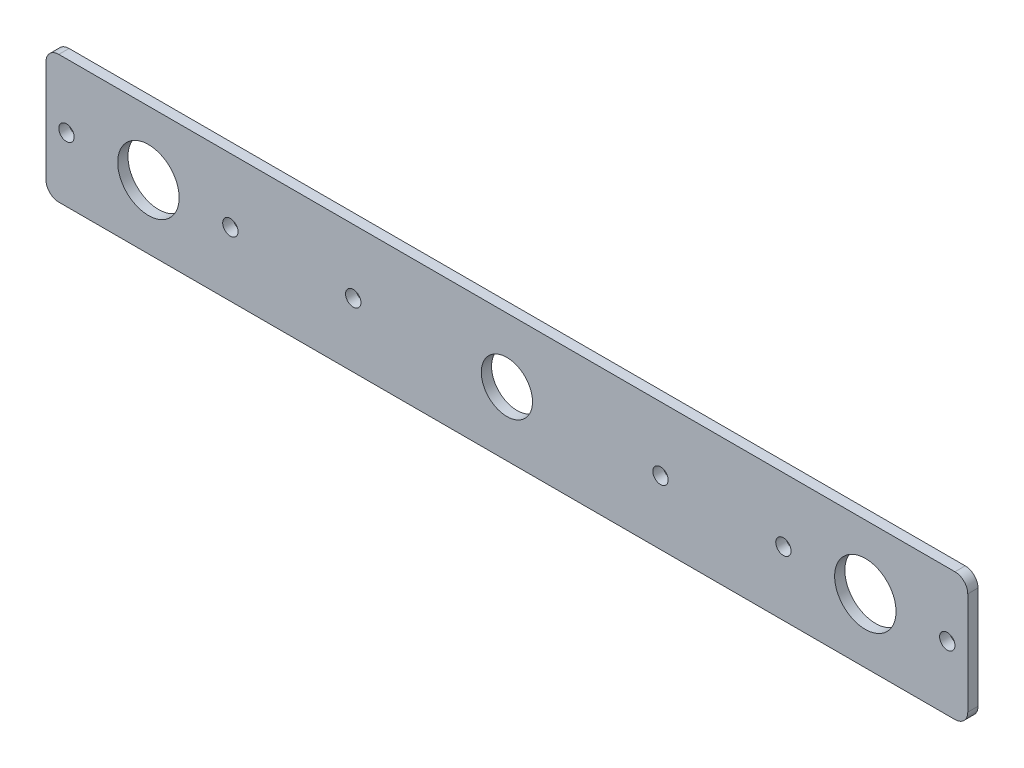
ISO-10303-21;
HEADER;
FILE_DESCRIPTION(('STEP AP214'),'2;1');
FILE_NAME('part.step','',(''),(''),'','','');
FILE_SCHEMA(('AUTOMOTIVE_DESIGN { 1 0 10303 214 1 1 1 1 }'));
ENDSEC;
DATA;
#1=APPLICATION_CONTEXT('core data for automotive mechanical design processes');
#2=APPLICATION_PROTOCOL_DEFINITION('international standard','automotive_design',2000,#1);
#3=PRODUCT_CONTEXT('',#1,'mechanical');
#4=PRODUCT('Part','Part','',(#3));
#5=PRODUCT_RELATED_PRODUCT_CATEGORY('part','',(#4));
#6=PRODUCT_DEFINITION_FORMATION('','',#4);
#7=PRODUCT_DEFINITION_CONTEXT('part definition',#1,'design');
#8=PRODUCT_DEFINITION('design','',#6,#7);
#9=PRODUCT_DEFINITION_SHAPE('','',#8);
#10=(LENGTH_UNIT() NAMED_UNIT(*) SI_UNIT(.MILLI.,.METRE.));
#11=(NAMED_UNIT(*) PLANE_ANGLE_UNIT() SI_UNIT($,.RADIAN.));
#12=(NAMED_UNIT(*) SI_UNIT($,.STERADIAN.) SOLID_ANGLE_UNIT());
#13=UNCERTAINTY_MEASURE_WITH_UNIT(LENGTH_MEASURE(1.E-05),#10,'distance_accuracy_value','');
#14=(GEOMETRIC_REPRESENTATION_CONTEXT(3) GLOBAL_UNCERTAINTY_ASSIGNED_CONTEXT((#13)) GLOBAL_UNIT_ASSIGNED_CONTEXT((#10,
#11,#12)) REPRESENTATION_CONTEXT('',''));
#15=CARTESIAN_POINT('',(0.,0.,0.));
#16=DIRECTION('',(0.,0.,1.));
#17=DIRECTION('',(1.,0.,0.));
#18=AXIS2_PLACEMENT_3D('',#15,#16,#17);
#19=CARTESIAN_POINT('',(-87.5,2.5,2.));
#20=DIRECTION('',(0.,0.,1.));
#21=DIRECTION('',(1.,0.,0.));
#22=AXIS2_PLACEMENT_3D('',#19,#20,#21);
#23=PLANE('',#22);
#24=CARTESIAN_POINT('',(-30.,12.5,2.));
#25=DIRECTION('',(0.,0.,1.));
#26=DIRECTION('',(1.,0.,0.));
#27=AXIS2_PLACEMENT_3D('',#24,#25,#26);
#28=CIRCLE('',#27,1.5);
#29=CARTESIAN_POINT('',(-28.5,12.5,2.));
#30=VERTEX_POINT('',#29);
#31=EDGE_CURVE('E218',#30,#30,#28,.T.);
#32=ORIENTED_EDGE('',*,*,#31,.F.);
#33=EDGE_LOOP('',(#32));
#34=FACE_BOUND('',#33,.T.);
#35=CARTESIAN_POINT('',(-54.,12.5,2.));
#36=DIRECTION('',(0.,0.,1.));
#37=DIRECTION('',(1.,0.,0.));
#38=AXIS2_PLACEMENT_3D('',#35,#36,#37);
#39=CIRCLE('',#38,1.5);
#40=CARTESIAN_POINT('',(-52.5,12.5,2.));
#41=VERTEX_POINT('',#40);
#42=EDGE_CURVE('E206',#41,#41,#39,.T.);
#43=ORIENTED_EDGE('',*,*,#42,.F.);
#44=EDGE_LOOP('',(#43));
#45=FACE_BOUND('',#44,.T.);
#46=CARTESIAN_POINT('',(-70.,12.5,2.));
#47=DIRECTION('',(0.,0.,1.));
#48=DIRECTION('',(1.,0.,0.));
#49=AXIS2_PLACEMENT_3D('',#46,#47,#48);
#50=CIRCLE('',#49,6.);
#51=CARTESIAN_POINT('',(-64.,12.5,2.));
#52=VERTEX_POINT('',#51);
#53=EDGE_CURVE('E194',#52,#52,#50,.T.);
#54=ORIENTED_EDGE('',*,*,#53,.F.);
#55=EDGE_LOOP('',(#54));
#56=FACE_BOUND('',#55,.T.);
#57=CARTESIAN_POINT('',(-86.,12.5,2.));
#58=DIRECTION('',(0.,0.,1.));
#59=DIRECTION('',(-1.,0.,0.));
#60=AXIS2_PLACEMENT_3D('',#57,#58,#59);
#61=CIRCLE('',#60,1.5);
#62=CARTESIAN_POINT('',(-87.5,12.5,2.));
#63=VERTEX_POINT('',#62);
#64=EDGE_CURVE('E182',#63,#63,#61,.T.);
#65=ORIENTED_EDGE('',*,*,#64,.F.);
#66=EDGE_LOOP('',(#65));
#67=FACE_BOUND('',#66,.T.);
#68=CARTESIAN_POINT('',(-87.5,2.5,2.));
#69=DIRECTION('',(0.,0.,1.));
#70=DIRECTION('',(1.,0.,0.));
#71=AXIS2_PLACEMENT_3D('',#68,#69,#70);
#72=CIRCLE('',#71,2.5);
#73=CARTESIAN_POINT('',(-90.,2.5,2.));
#74=VERTEX_POINT('',#73);
#75=CARTESIAN_POINT('',(-87.5,0.,2.));
#76=VERTEX_POINT('',#75);
#77=EDGE_CURVE('E145',#74,#76,#72,.T.);
#78=ORIENTED_EDGE('',*,*,#77,.T.);
#79=DIRECTION('',(1.,0.,0.));
#80=VECTOR('',#79,1.);
#81=CARTESIAN_POINT('',(-87.5,0.,2.));
#82=LINE('',#81,#80);
#83=CARTESIAN_POINT('',(87.5,0.,2.));
#84=VERTEX_POINT('',#83);
#85=EDGE_CURVE('E93',#76,#84,#82,.T.);
#86=ORIENTED_EDGE('',*,*,#85,.T.);
#87=CARTESIAN_POINT('',(87.5,2.5,2.));
#88=DIRECTION('',(0.,0.,1.));
#89=DIRECTION('',(1.,0.,0.));
#90=AXIS2_PLACEMENT_3D('',#87,#88,#89);
#91=CIRCLE('',#90,2.5);
#92=CARTESIAN_POINT('',(90.,2.5,2.));
#93=VERTEX_POINT('',#92);
#94=EDGE_CURVE('E160',#84,#93,#91,.T.);
#95=ORIENTED_EDGE('',*,*,#94,.T.);
#96=DIRECTION('',(0.,1.,0.));
#97=VECTOR('',#96,1.);
#98=CARTESIAN_POINT('',(90.,22.5,2.));
#99=LINE('',#98,#97);
#100=CARTESIAN_POINT('',(90.,22.5,2.));
#101=VERTEX_POINT('',#100);
#102=EDGE_CURVE('E173',#93,#101,#99,.T.);
#103=ORIENTED_EDGE('',*,*,#102,.T.);
#104=CARTESIAN_POINT('',(87.5,22.5,2.));
#105=DIRECTION('',(0.,0.,1.));
#106=DIRECTION('',(1.,0.,0.));
#107=AXIS2_PLACEMENT_3D('',#104,#105,#106);
#108=CIRCLE('',#107,2.5);
#109=CARTESIAN_POINT('',(87.5,25.,2.));
#110=VERTEX_POINT('',#109);
#111=EDGE_CURVE('E112',#101,#110,#108,.T.);
#112=ORIENTED_EDGE('',*,*,#111,.T.);
#113=DIRECTION('',(-1.,0.,0.));
#114=VECTOR('',#113,1.);
#115=CARTESIAN_POINT('',(-87.5,25.,2.));
#116=LINE('',#115,#114);
#117=CARTESIAN_POINT('',(-87.5,25.,2.));
#118=VERTEX_POINT('',#117);
#119=EDGE_CURVE('E106',#110,#118,#116,.T.);
#120=ORIENTED_EDGE('',*,*,#119,.T.);
#121=CARTESIAN_POINT('',(-87.5,22.5,2.));
#122=DIRECTION('',(0.,0.,1.));
#123=DIRECTION('',(1.,0.,0.));
#124=AXIS2_PLACEMENT_3D('',#121,#122,#123);
#125=CIRCLE('',#124,2.5);
#126=CARTESIAN_POINT('',(-90.,22.5,2.));
#127=VERTEX_POINT('',#126);
#128=EDGE_CURVE('E110',#118,#127,#125,.T.);
#129=ORIENTED_EDGE('',*,*,#128,.T.);
#130=DIRECTION('',(0.,-1.,0.));
#131=VECTOR('',#130,1.);
#132=CARTESIAN_POINT('',(-90.,22.5,2.));
#133=LINE('',#132,#131);
#134=EDGE_CURVE('E50',#127,#74,#133,.T.);
#135=ORIENTED_EDGE('',*,*,#134,.T.);
#136=EDGE_LOOP('',(#78,#86,#95,#103,#112,#120,#129,#135));
#137=FACE_BOUND('',#136,.T.);
#138=CARTESIAN_POINT('',(86.,12.5,2.));
#139=DIRECTION('',(0.,0.,1.));
#140=DIRECTION('',(1.,0.,0.));
#141=AXIS2_PLACEMENT_3D('',#138,#139,#140);
#142=CIRCLE('',#141,1.5);
#143=CARTESIAN_POINT('',(87.5,12.5,2.));
#144=VERTEX_POINT('',#143);
#145=EDGE_CURVE('E134',#144,#144,#142,.T.);
#146=ORIENTED_EDGE('',*,*,#145,.F.);
#147=EDGE_LOOP('',(#146));
#148=FACE_BOUND('',#147,.T.);
#149=CARTESIAN_POINT('',(0.,12.5,2.));
#150=DIRECTION('',(0.,0.,1.));
#151=DIRECTION('',(1.,0.,0.));
#152=AXIS2_PLACEMENT_3D('',#149,#150,#151);
#153=CIRCLE('',#152,5.);
#154=CARTESIAN_POINT('',(5.,12.5,2.));
#155=VERTEX_POINT('',#154);
#156=EDGE_CURVE('E188',#155,#155,#153,.T.);
#157=ORIENTED_EDGE('',*,*,#156,.F.);
#158=EDGE_LOOP('',(#157));
#159=FACE_BOUND('',#158,.T.);
#160=CARTESIAN_POINT('',(70.,12.5,2.));
#161=DIRECTION('',(0.,0.,1.));
#162=DIRECTION('',(-1.,0.,0.));
#163=AXIS2_PLACEMENT_3D('',#160,#161,#162);
#164=CIRCLE('',#163,6.);
#165=CARTESIAN_POINT('',(64.,12.5,2.));
#166=VERTEX_POINT('',#165);
#167=EDGE_CURVE('E200',#166,#166,#164,.T.);
#168=ORIENTED_EDGE('',*,*,#167,.F.);
#169=EDGE_LOOP('',(#168));
#170=FACE_BOUND('',#169,.T.);
#171=CARTESIAN_POINT('',(54.,12.5,2.));
#172=DIRECTION('',(0.,0.,1.));
#173=DIRECTION('',(-1.,0.,0.));
#174=AXIS2_PLACEMENT_3D('',#171,#172,#173);
#175=CIRCLE('',#174,1.5);
#176=CARTESIAN_POINT('',(52.5,12.5,2.));
#177=VERTEX_POINT('',#176);
#178=EDGE_CURVE('E212',#177,#177,#175,.T.);
#179=ORIENTED_EDGE('',*,*,#178,.F.);
#180=EDGE_LOOP('',(#179));
#181=FACE_BOUND('',#180,.T.);
#182=CARTESIAN_POINT('',(30.,12.5,2.));
#183=DIRECTION('',(0.,0.,1.));
#184=DIRECTION('',(-1.,0.,0.));
#185=AXIS2_PLACEMENT_3D('',#182,#183,#184);
#186=CIRCLE('',#185,1.5);
#187=CARTESIAN_POINT('',(28.5,12.5,2.));
#188=VERTEX_POINT('',#187);
#189=EDGE_CURVE('E224',#188,#188,#186,.T.);
#190=ORIENTED_EDGE('',*,*,#189,.F.);
#191=EDGE_LOOP('',(#190));
#192=FACE_BOUND('',#191,.T.);
#193=ADVANCED_FACE('F33',(#34,#45,#56,#67,#137,#148,#159,#170,#181,#192),#23,.T.);
#194=CARTESIAN_POINT('',(-87.5,2.5,0.));
#195=DIRECTION('',(0.,0.,1.));
#196=DIRECTION('',(1.,0.,0.));
#197=AXIS2_PLACEMENT_3D('',#194,#195,#196);
#198=PLANE('',#197);
#199=CARTESIAN_POINT('',(-87.5,2.5,0.));
#200=DIRECTION('',(0.,0.,1.));
#201=DIRECTION('',(1.,0.,0.));
#202=AXIS2_PLACEMENT_3D('',#199,#200,#201);
#203=CIRCLE('',#202,2.5);
#204=CARTESIAN_POINT('',(-90.,2.5,0.));
#205=VERTEX_POINT('',#204);
#206=CARTESIAN_POINT('',(-87.5,0.,0.));
#207=VERTEX_POINT('',#206);
#208=EDGE_CURVE('E130',#205,#207,#203,.T.);
#209=ORIENTED_EDGE('',*,*,#208,.F.);
#210=DIRECTION('',(0.,-1.,0.));
#211=VECTOR('',#210,1.);
#212=CARTESIAN_POINT('',(-90.,22.5,0.));
#213=LINE('',#212,#211);
#214=CARTESIAN_POINT('',(-90.,22.5,0.));
#215=VERTEX_POINT('',#214);
#216=EDGE_CURVE('E85',#215,#205,#213,.T.);
#217=ORIENTED_EDGE('',*,*,#216,.F.);
#218=CARTESIAN_POINT('',(-87.5,22.5,0.));
#219=DIRECTION('',(0.,0.,1.));
#220=DIRECTION('',(1.,0.,0.));
#221=AXIS2_PLACEMENT_3D('',#218,#219,#220);
#222=CIRCLE('',#221,2.5);
#223=CARTESIAN_POINT('',(-87.5,25.,0.));
#224=VERTEX_POINT('',#223);
#225=EDGE_CURVE('E79',#224,#215,#222,.T.);
#226=ORIENTED_EDGE('',*,*,#225,.F.);
#227=DIRECTION('',(-1.,0.,0.));
#228=VECTOR('',#227,1.);
#229=CARTESIAN_POINT('',(-87.5,25.,0.));
#230=LINE('',#229,#228);
#231=CARTESIAN_POINT('',(87.5,25.,0.));
#232=VERTEX_POINT('',#231);
#233=EDGE_CURVE('E120',#232,#224,#230,.T.);
#234=ORIENTED_EDGE('',*,*,#233,.F.);
#235=CARTESIAN_POINT('',(87.5,22.5,0.));
#236=DIRECTION('',(0.,0.,1.));
#237=DIRECTION('',(1.,0.,0.));
#238=AXIS2_PLACEMENT_3D('',#235,#236,#237);
#239=CIRCLE('',#238,2.5);
#240=CARTESIAN_POINT('',(90.,22.5,0.));
#241=VERTEX_POINT('',#240);
#242=EDGE_CURVE('E140',#241,#232,#239,.T.);
#243=ORIENTED_EDGE('',*,*,#242,.F.);
#244=DIRECTION('',(0.,1.,0.));
#245=VECTOR('',#244,1.);
#246=CARTESIAN_POINT('',(90.,22.5,0.));
#247=LINE('',#246,#245);
#248=CARTESIAN_POINT('',(90.,2.5,0.));
#249=VERTEX_POINT('',#248);
#250=EDGE_CURVE('E138',#249,#241,#247,.T.);
#251=ORIENTED_EDGE('',*,*,#250,.F.);
#252=CARTESIAN_POINT('',(87.5,2.5,0.));
#253=DIRECTION('',(0.,0.,1.));
#254=DIRECTION('',(1.,0.,0.));
#255=AXIS2_PLACEMENT_3D('',#252,#253,#254);
#256=CIRCLE('',#255,2.5);
#257=CARTESIAN_POINT('',(87.5,0.,0.));
#258=VERTEX_POINT('',#257);
#259=EDGE_CURVE('E136',#258,#249,#256,.T.);
#260=ORIENTED_EDGE('',*,*,#259,.F.);
#261=DIRECTION('',(1.,0.,0.));
#262=VECTOR('',#261,1.);
#263=CARTESIAN_POINT('',(-87.5,0.,0.));
#264=LINE('',#263,#262);
#265=EDGE_CURVE('E133',#207,#258,#264,.T.);
#266=ORIENTED_EDGE('',*,*,#265,.F.);
#267=EDGE_LOOP('',(#209,#217,#226,#234,#243,#251,#260,#266));
#268=FACE_BOUND('',#267,.T.);
#269=CARTESIAN_POINT('',(86.,12.5,0.));
#270=DIRECTION('',(0.,0.,1.));
#271=DIRECTION('',(1.,0.,0.));
#272=AXIS2_PLACEMENT_3D('',#269,#270,#271);
#273=CIRCLE('',#272,1.5);
#274=CARTESIAN_POINT('',(87.5,12.5,0.));
#275=VERTEX_POINT('',#274);
#276=EDGE_CURVE('E179',#275,#275,#273,.T.);
#277=ORIENTED_EDGE('',*,*,#276,.T.);
#278=EDGE_LOOP('',(#277));
#279=FACE_BOUND('',#278,.T.);
#280=CARTESIAN_POINT('',(-86.,12.5,0.));
#281=DIRECTION('',(0.,0.,1.));
#282=DIRECTION('',(-1.,0.,0.));
#283=AXIS2_PLACEMENT_3D('',#280,#281,#282);
#284=CIRCLE('',#283,1.5);
#285=CARTESIAN_POINT('',(-87.5,12.5,0.));
#286=VERTEX_POINT('',#285);
#287=EDGE_CURVE('E185',#286,#286,#284,.T.);
#288=ORIENTED_EDGE('',*,*,#287,.T.);
#289=EDGE_LOOP('',(#288));
#290=FACE_BOUND('',#289,.T.);
#291=CARTESIAN_POINT('',(0.,12.5,0.));
#292=DIRECTION('',(0.,0.,1.));
#293=DIRECTION('',(1.,0.,0.));
#294=AXIS2_PLACEMENT_3D('',#291,#292,#293);
#295=CIRCLE('',#294,5.);
#296=CARTESIAN_POINT('',(5.,12.5,0.));
#297=VERTEX_POINT('',#296);
#298=EDGE_CURVE('E191',#297,#297,#295,.T.);
#299=ORIENTED_EDGE('',*,*,#298,.T.);
#300=EDGE_LOOP('',(#299));
#301=FACE_BOUND('',#300,.T.);
#302=CARTESIAN_POINT('',(-70.,12.5,0.));
#303=DIRECTION('',(0.,0.,1.));
#304=DIRECTION('',(1.,0.,0.));
#305=AXIS2_PLACEMENT_3D('',#302,#303,#304);
#306=CIRCLE('',#305,6.);
#307=CARTESIAN_POINT('',(-64.,12.5,0.));
#308=VERTEX_POINT('',#307);
#309=EDGE_CURVE('E197',#308,#308,#306,.T.);
#310=ORIENTED_EDGE('',*,*,#309,.T.);
#311=EDGE_LOOP('',(#310));
#312=FACE_BOUND('',#311,.T.);
#313=CARTESIAN_POINT('',(70.,12.5,0.));
#314=DIRECTION('',(0.,0.,1.));
#315=DIRECTION('',(-1.,0.,0.));
#316=AXIS2_PLACEMENT_3D('',#313,#314,#315);
#317=CIRCLE('',#316,6.);
#318=CARTESIAN_POINT('',(64.,12.5,0.));
#319=VERTEX_POINT('',#318);
#320=EDGE_CURVE('E203',#319,#319,#317,.T.);
#321=ORIENTED_EDGE('',*,*,#320,.T.);
#322=EDGE_LOOP('',(#321));
#323=FACE_BOUND('',#322,.T.);
#324=CARTESIAN_POINT('',(-54.,12.5,0.));
#325=DIRECTION('',(0.,0.,1.));
#326=DIRECTION('',(1.,0.,0.));
#327=AXIS2_PLACEMENT_3D('',#324,#325,#326);
#328=CIRCLE('',#327,1.5);
#329=CARTESIAN_POINT('',(-52.5,12.5,0.));
#330=VERTEX_POINT('',#329);
#331=EDGE_CURVE('E209',#330,#330,#328,.T.);
#332=ORIENTED_EDGE('',*,*,#331,.T.);
#333=EDGE_LOOP('',(#332));
#334=FACE_BOUND('',#333,.T.);
#335=CARTESIAN_POINT('',(54.,12.5,0.));
#336=DIRECTION('',(0.,0.,1.));
#337=DIRECTION('',(-1.,0.,0.));
#338=AXIS2_PLACEMENT_3D('',#335,#336,#337);
#339=CIRCLE('',#338,1.5);
#340=CARTESIAN_POINT('',(52.5,12.5,0.));
#341=VERTEX_POINT('',#340);
#342=EDGE_CURVE('E215',#341,#341,#339,.T.);
#343=ORIENTED_EDGE('',*,*,#342,.T.);
#344=EDGE_LOOP('',(#343));
#345=FACE_BOUND('',#344,.T.);
#346=CARTESIAN_POINT('',(-30.,12.5,0.));
#347=DIRECTION('',(0.,0.,1.));
#348=DIRECTION('',(1.,0.,0.));
#349=AXIS2_PLACEMENT_3D('',#346,#347,#348);
#350=CIRCLE('',#349,1.5);
#351=CARTESIAN_POINT('',(-28.5,12.5,0.));
#352=VERTEX_POINT('',#351);
#353=EDGE_CURVE('E221',#352,#352,#350,.T.);
#354=ORIENTED_EDGE('',*,*,#353,.T.);
#355=EDGE_LOOP('',(#354));
#356=FACE_BOUND('',#355,.T.);
#357=CARTESIAN_POINT('',(30.,12.5,0.));
#358=DIRECTION('',(0.,0.,1.));
#359=DIRECTION('',(-1.,0.,0.));
#360=AXIS2_PLACEMENT_3D('',#357,#358,#359);
#361=CIRCLE('',#360,1.5);
#362=CARTESIAN_POINT('',(28.5,12.5,0.));
#363=VERTEX_POINT('',#362);
#364=EDGE_CURVE('E227',#363,#363,#361,.T.);
#365=ORIENTED_EDGE('',*,*,#364,.T.);
#366=EDGE_LOOP('',(#365));
#367=FACE_BOUND('',#366,.T.);
#368=ADVANCED_FACE('F164',(#268,#279,#290,#301,#312,#323,#334,#345,#356,#367),#198,.F.);
#369=CARTESIAN_POINT('',(-87.5,2.5,2.));
#370=DIRECTION('',(0.,0.,-1.));
#371=DIRECTION('',(-1.,0.,0.));
#372=AXIS2_PLACEMENT_3D('',#369,#370,#371);
#373=CYLINDRICAL_SURFACE('',#372,2.5);
#374=ORIENTED_EDGE('',*,*,#208,.T.);
#375=DIRECTION('',(0.,0.,-1.));
#376=VECTOR('',#375,1.);
#377=CARTESIAN_POINT('',(-87.5,0.,2.));
#378=LINE('',#377,#376);
#379=EDGE_CURVE('E11',#76,#207,#378,.T.);
#380=ORIENTED_EDGE('',*,*,#379,.F.);
#381=ORIENTED_EDGE('',*,*,#77,.F.);
#382=DIRECTION('',(0.,0.,-1.));
#383=VECTOR('',#382,1.);
#384=CARTESIAN_POINT('',(-90.,2.5,2.));
#385=LINE('',#384,#383);
#386=EDGE_CURVE('E126',#74,#205,#385,.T.);
#387=ORIENTED_EDGE('',*,*,#386,.T.);
#388=EDGE_LOOP('',(#374,#380,#381,#387));
#389=FACE_BOUND('',#388,.T.);
#390=ADVANCED_FACE('F35',(#389),#373,.T.);
#391=CARTESIAN_POINT('',(-87.5,0.,2.));
#392=DIRECTION('',(0.,1.,0.));
#393=DIRECTION('',(0.,0.,1.));
#394=AXIS2_PLACEMENT_3D('',#391,#392,#393);
#395=PLANE('',#394);
#396=ORIENTED_EDGE('',*,*,#265,.T.);
#397=DIRECTION('',(0.,0.,-1.));
#398=VECTOR('',#397,1.);
#399=CARTESIAN_POINT('',(87.5,0.,2.));
#400=LINE('',#399,#398);
#401=EDGE_CURVE('E42',#84,#258,#400,.T.);
#402=ORIENTED_EDGE('',*,*,#401,.F.);
#403=ORIENTED_EDGE('',*,*,#85,.F.);
#404=ORIENTED_EDGE('',*,*,#379,.T.);
#405=EDGE_LOOP('',(#396,#402,#403,#404));
#406=FACE_BOUND('',#405,.T.);
#407=ADVANCED_FACE('F261',(#406),#395,.F.);
#408=CARTESIAN_POINT('',(87.5,2.5,2.));
#409=DIRECTION('',(0.,0.,-1.));
#410=DIRECTION('',(-1.,0.,0.));
#411=AXIS2_PLACEMENT_3D('',#408,#409,#410);
#412=CYLINDRICAL_SURFACE('',#411,2.5);
#413=ORIENTED_EDGE('',*,*,#259,.T.);
#414=DIRECTION('',(0.,0.,-1.));
#415=VECTOR('',#414,1.);
#416=CARTESIAN_POINT('',(90.,2.5,2.));
#417=LINE('',#416,#415);
#418=EDGE_CURVE('E152',#93,#249,#417,.T.);
#419=ORIENTED_EDGE('',*,*,#418,.F.);
#420=ORIENTED_EDGE('',*,*,#94,.F.);
#421=ORIENTED_EDGE('',*,*,#401,.T.);
#422=EDGE_LOOP('',(#413,#419,#420,#421));
#423=FACE_BOUND('',#422,.T.);
#424=ADVANCED_FACE('F158',(#423),#412,.T.);
#425=CARTESIAN_POINT('',(90.,22.5,2.));
#426=DIRECTION('',(-1.,0.,0.));
#427=DIRECTION('',(0.,0.,1.));
#428=AXIS2_PLACEMENT_3D('',#425,#426,#427);
#429=PLANE('',#428);
#430=ORIENTED_EDGE('',*,*,#250,.T.);
#431=DIRECTION('',(0.,0.,-1.));
#432=VECTOR('',#431,1.);
#433=CARTESIAN_POINT('',(90.,22.5,2.));
#434=LINE('',#433,#432);
#435=EDGE_CURVE('E149',#101,#241,#434,.T.);
#436=ORIENTED_EDGE('',*,*,#435,.F.);
#437=ORIENTED_EDGE('',*,*,#102,.F.);
#438=ORIENTED_EDGE('',*,*,#418,.T.);
#439=EDGE_LOOP('',(#430,#436,#437,#438));
#440=FACE_BOUND('',#439,.T.);
#441=ADVANCED_FACE('F169',(#440),#429,.F.);
#442=CARTESIAN_POINT('',(87.5,22.5,2.));
#443=DIRECTION('',(0.,0.,-1.));
#444=DIRECTION('',(-1.,0.,0.));
#445=AXIS2_PLACEMENT_3D('',#442,#443,#444);
#446=CYLINDRICAL_SURFACE('',#445,2.5);
#447=ORIENTED_EDGE('',*,*,#242,.T.);
#448=DIRECTION('',(0.,0.,-1.));
#449=VECTOR('',#448,1.);
#450=CARTESIAN_POINT('',(87.5,25.,2.));
#451=LINE('',#450,#449);
#452=EDGE_CURVE('E121',#110,#232,#451,.T.);
#453=ORIENTED_EDGE('',*,*,#452,.F.);
#454=ORIENTED_EDGE('',*,*,#111,.F.);
#455=ORIENTED_EDGE('',*,*,#435,.T.);
#456=EDGE_LOOP('',(#447,#453,#454,#455));
#457=FACE_BOUND('',#456,.T.);
#458=ADVANCED_FACE('F172',(#457),#446,.T.);
#459=CARTESIAN_POINT('',(-87.5,25.,2.));
#460=DIRECTION('',(0.,-1.,0.));
#461=DIRECTION('',(0.,0.,-1.));
#462=AXIS2_PLACEMENT_3D('',#459,#460,#461);
#463=PLANE('',#462);
#464=ORIENTED_EDGE('',*,*,#233,.T.);
#465=DIRECTION('',(0.,0.,-1.));
#466=VECTOR('',#465,1.);
#467=CARTESIAN_POINT('',(-87.5,25.,2.));
#468=LINE('',#467,#466);
#469=EDGE_CURVE('E117',#118,#224,#468,.T.);
#470=ORIENTED_EDGE('',*,*,#469,.F.);
#471=ORIENTED_EDGE('',*,*,#119,.F.);
#472=ORIENTED_EDGE('',*,*,#452,.T.);
#473=EDGE_LOOP('',(#464,#470,#471,#472));
#474=FACE_BOUND('',#473,.T.);
#475=ADVANCED_FACE('F118',(#474),#463,.F.);
#476=CARTESIAN_POINT('',(-87.5,22.5,2.));
#477=DIRECTION('',(0.,0.,-1.));
#478=DIRECTION('',(-1.,0.,0.));
#479=AXIS2_PLACEMENT_3D('',#476,#477,#478);
#480=CYLINDRICAL_SURFACE('',#479,2.5);
#481=ORIENTED_EDGE('',*,*,#225,.T.);
#482=DIRECTION('',(0.,0.,-1.));
#483=VECTOR('',#482,1.);
#484=CARTESIAN_POINT('',(-90.,22.5,2.));
#485=LINE('',#484,#483);
#486=EDGE_CURVE('E122',#127,#215,#485,.T.);
#487=ORIENTED_EDGE('',*,*,#486,.F.);
#488=ORIENTED_EDGE('',*,*,#128,.F.);
#489=ORIENTED_EDGE('',*,*,#469,.T.);
#490=EDGE_LOOP('',(#481,#487,#488,#489));
#491=FACE_BOUND('',#490,.T.);
#492=ADVANCED_FACE('F124',(#491),#480,.T.);
#493=CARTESIAN_POINT('',(-90.,22.5,2.));
#494=DIRECTION('',(1.,0.,0.));
#495=DIRECTION('',(0.,0.,-1.));
#496=AXIS2_PLACEMENT_3D('',#493,#494,#495);
#497=PLANE('',#496);
#498=ORIENTED_EDGE('',*,*,#216,.T.);
#499=ORIENTED_EDGE('',*,*,#386,.F.);
#500=ORIENTED_EDGE('',*,*,#134,.F.);
#501=ORIENTED_EDGE('',*,*,#486,.T.);
#502=EDGE_LOOP('',(#498,#499,#500,#501));
#503=FACE_BOUND('',#502,.T.);
#504=ADVANCED_FACE('F249',(#503),#497,.F.);
#505=CARTESIAN_POINT('',(86.,12.5,2.));
#506=DIRECTION('',(0.,0.,-1.));
#507=DIRECTION('',(-1.,0.,0.));
#508=AXIS2_PLACEMENT_3D('',#505,#506,#507);
#509=CYLINDRICAL_SURFACE('',#508,1.5);
#510=ORIENTED_EDGE('',*,*,#145,.T.);
#511=EDGE_LOOP('',(#510));
#512=FACE_BOUND('',#511,.T.);
#513=ORIENTED_EDGE('',*,*,#276,.F.);
#514=EDGE_LOOP('',(#513));
#515=FACE_BOUND('',#514,.T.);
#516=ADVANCED_FACE('F246',(#512,#515),#509,.F.);
#517=CARTESIAN_POINT('',(-86.,12.5,2.));
#518=DIRECTION('',(0.,0.,-1.));
#519=DIRECTION('',(-1.,0.,0.));
#520=AXIS2_PLACEMENT_3D('',#517,#518,#519);
#521=CYLINDRICAL_SURFACE('',#520,1.5);
#522=ORIENTED_EDGE('',*,*,#64,.T.);
#523=EDGE_LOOP('',(#522));
#524=FACE_BOUND('',#523,.T.);
#525=ORIENTED_EDGE('',*,*,#287,.F.);
#526=EDGE_LOOP('',(#525));
#527=FACE_BOUND('',#526,.T.);
#528=ADVANCED_FACE('F325',(#524,#527),#521,.F.);
#529=CARTESIAN_POINT('',(0.,12.5,2.));
#530=DIRECTION('',(0.,0.,-1.));
#531=DIRECTION('',(-1.,0.,0.));
#532=AXIS2_PLACEMENT_3D('',#529,#530,#531);
#533=CYLINDRICAL_SURFACE('',#532,5.);
#534=ORIENTED_EDGE('',*,*,#156,.T.);
#535=EDGE_LOOP('',(#534));
#536=FACE_BOUND('',#535,.T.);
#537=ORIENTED_EDGE('',*,*,#298,.F.);
#538=EDGE_LOOP('',(#537));
#539=FACE_BOUND('',#538,.T.);
#540=ADVANCED_FACE('F333',(#536,#539),#533,.F.);
#541=CARTESIAN_POINT('',(-70.,12.5,2.));
#542=DIRECTION('',(0.,0.,-1.));
#543=DIRECTION('',(-1.,0.,0.));
#544=AXIS2_PLACEMENT_3D('',#541,#542,#543);
#545=CYLINDRICAL_SURFACE('',#544,6.);
#546=ORIENTED_EDGE('',*,*,#53,.T.);
#547=EDGE_LOOP('',(#546));
#548=FACE_BOUND('',#547,.T.);
#549=ORIENTED_EDGE('',*,*,#309,.F.);
#550=EDGE_LOOP('',(#549));
#551=FACE_BOUND('',#550,.T.);
#552=ADVANCED_FACE('F341',(#548,#551),#545,.F.);
#553=CARTESIAN_POINT('',(70.,12.5,2.));
#554=DIRECTION('',(0.,0.,-1.));
#555=DIRECTION('',(-1.,0.,0.));
#556=AXIS2_PLACEMENT_3D('',#553,#554,#555);
#557=CYLINDRICAL_SURFACE('',#556,6.);
#558=ORIENTED_EDGE('',*,*,#167,.T.);
#559=EDGE_LOOP('',(#558));
#560=FACE_BOUND('',#559,.T.);
#561=ORIENTED_EDGE('',*,*,#320,.F.);
#562=EDGE_LOOP('',(#561));
#563=FACE_BOUND('',#562,.T.);
#564=ADVANCED_FACE('F350',(#560,#563),#557,.F.);
#565=CARTESIAN_POINT('',(-54.,12.5,2.));
#566=DIRECTION('',(0.,0.,-1.));
#567=DIRECTION('',(-1.,0.,0.));
#568=AXIS2_PLACEMENT_3D('',#565,#566,#567);
#569=CYLINDRICAL_SURFACE('',#568,1.5);
#570=ORIENTED_EDGE('',*,*,#42,.T.);
#571=EDGE_LOOP('',(#570));
#572=FACE_BOUND('',#571,.T.);
#573=ORIENTED_EDGE('',*,*,#331,.F.);
#574=EDGE_LOOP('',(#573));
#575=FACE_BOUND('',#574,.T.);
#576=ADVANCED_FACE('F359',(#572,#575),#569,.F.);
#577=CARTESIAN_POINT('',(54.,12.5,2.));
#578=DIRECTION('',(0.,0.,-1.));
#579=DIRECTION('',(-1.,0.,0.));
#580=AXIS2_PLACEMENT_3D('',#577,#578,#579);
#581=CYLINDRICAL_SURFACE('',#580,1.5);
#582=ORIENTED_EDGE('',*,*,#178,.T.);
#583=EDGE_LOOP('',(#582));
#584=FACE_BOUND('',#583,.T.);
#585=ORIENTED_EDGE('',*,*,#342,.F.);
#586=EDGE_LOOP('',(#585));
#587=FACE_BOUND('',#586,.T.);
#588=ADVANCED_FACE('F368',(#584,#587),#581,.F.);
#589=CARTESIAN_POINT('',(-30.,12.5,2.));
#590=DIRECTION('',(0.,0.,-1.));
#591=DIRECTION('',(-1.,0.,0.));
#592=AXIS2_PLACEMENT_3D('',#589,#590,#591);
#593=CYLINDRICAL_SURFACE('',#592,1.5);
#594=ORIENTED_EDGE('',*,*,#31,.T.);
#595=EDGE_LOOP('',(#594));
#596=FACE_BOUND('',#595,.T.);
#597=ORIENTED_EDGE('',*,*,#353,.F.);
#598=EDGE_LOOP('',(#597));
#599=FACE_BOUND('',#598,.T.);
#600=ADVANCED_FACE('F377',(#596,#599),#593,.F.);
#601=CARTESIAN_POINT('',(30.,12.5,2.));
#602=DIRECTION('',(0.,0.,-1.));
#603=DIRECTION('',(-1.,0.,0.));
#604=AXIS2_PLACEMENT_3D('',#601,#602,#603);
#605=CYLINDRICAL_SURFACE('',#604,1.5);
#606=ORIENTED_EDGE('',*,*,#189,.T.);
#607=EDGE_LOOP('',(#606));
#608=FACE_BOUND('',#607,.T.);
#609=ORIENTED_EDGE('',*,*,#364,.F.);
#610=EDGE_LOOP('',(#609));
#611=FACE_BOUND('',#610,.T.);
#612=ADVANCED_FACE('F233',(#608,#611),#605,.F.);
#613=CLOSED_SHELL('',(#193,#368,#390,#407,#424,#441,#458,#475,#492,#504,#516,#528,#540,#552,
#564,#576,#588,#600,#612));
#614=MANIFOLD_SOLID_BREP('B2',#613);
#615=ADVANCED_BREP_SHAPE_REPRESENTATION('',(#18,#614),#14);
#616=SHAPE_DEFINITION_REPRESENTATION(#9,#615);
ENDSEC;
END-ISO-10303-21;
